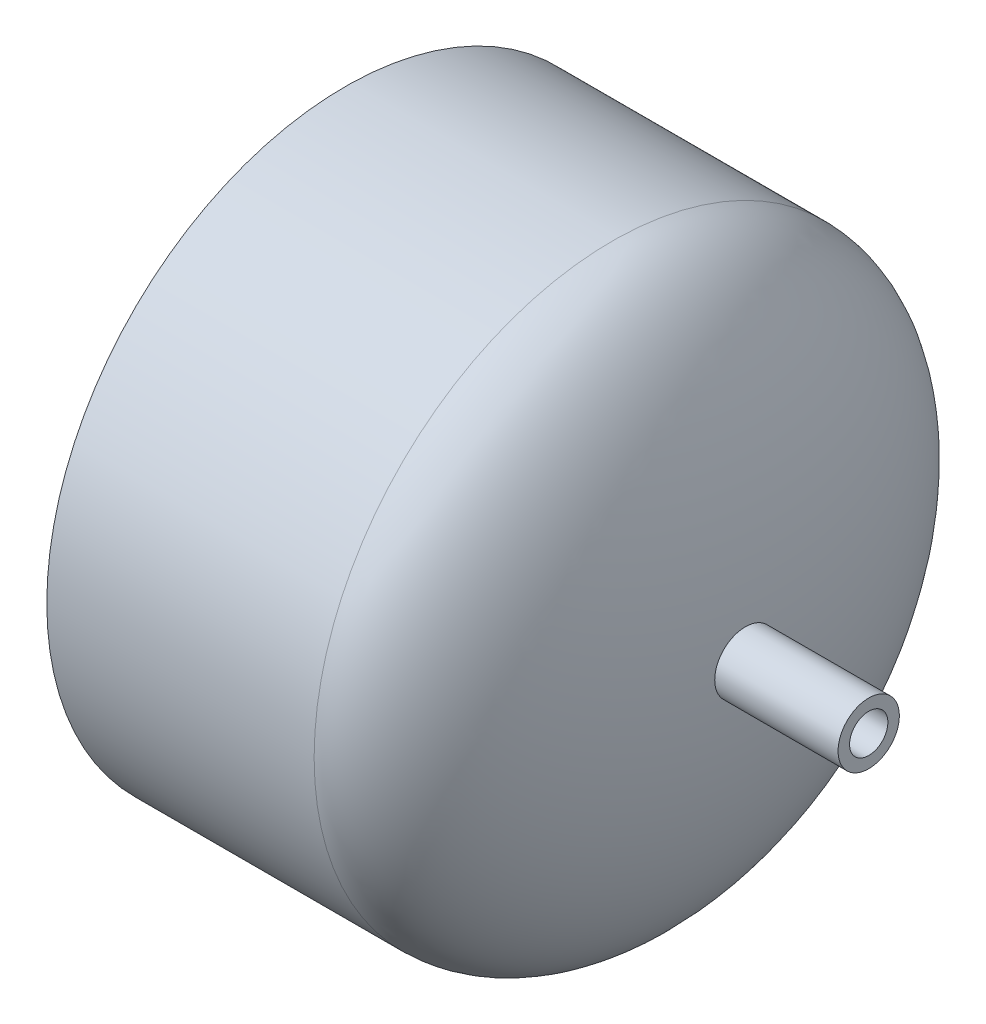
ISO-10303-21;
HEADER;
FILE_DESCRIPTION(('STEP AP214'),'2;1');
FILE_NAME('part.step','',(''),(''),'','','');
FILE_SCHEMA(('AUTOMOTIVE_DESIGN { 1 0 10303 214 1 1 1 1 }'));
ENDSEC;
DATA;
#1=APPLICATION_CONTEXT('core data for automotive mechanical design processes');
#2=APPLICATION_PROTOCOL_DEFINITION('international standard','automotive_design',2000,#1);
#3=PRODUCT_CONTEXT('',#1,'mechanical');
#4=PRODUCT('Part','Part','',(#3));
#5=PRODUCT_RELATED_PRODUCT_CATEGORY('part','',(#4));
#6=PRODUCT_DEFINITION_FORMATION('','',#4);
#7=PRODUCT_DEFINITION_CONTEXT('part definition',#1,'design');
#8=PRODUCT_DEFINITION('design','',#6,#7);
#9=PRODUCT_DEFINITION_SHAPE('','',#8);
#10=(LENGTH_UNIT() NAMED_UNIT(*) SI_UNIT(.MILLI.,.METRE.));
#11=(NAMED_UNIT(*) PLANE_ANGLE_UNIT() SI_UNIT($,.RADIAN.));
#12=(NAMED_UNIT(*) SI_UNIT($,.STERADIAN.) SOLID_ANGLE_UNIT());
#13=UNCERTAINTY_MEASURE_WITH_UNIT(LENGTH_MEASURE(1.E-05),#10,'distance_accuracy_value','');
#14=(GEOMETRIC_REPRESENTATION_CONTEXT(3) GLOBAL_UNCERTAINTY_ASSIGNED_CONTEXT((#13)) GLOBAL_UNIT_ASSIGNED_CONTEXT((#10,
#11,#12)) REPRESENTATION_CONTEXT('',''));
#15=CARTESIAN_POINT('',(0.,0.,0.));
#16=DIRECTION('',(0.,0.,1.));
#17=DIRECTION('',(1.,0.,0.));
#18=AXIS2_PLACEMENT_3D('',#15,#16,#17);
#19=CARTESIAN_POINT('',(-55.372,0.,0.));
#20=DIRECTION('',(0.,0.,1.));
#21=DIRECTION('',(0.,1.,0.));
#22=AXIS2_PLACEMENT_3D('',#19,#20,#21);
#23=ELLIPSE('',#22,123.571,55.372);
#24=TRIMMED_CURVE('',#23,(PARAMETER_VALUE(1.5707963267949)),(PARAMETER_VALUE(4.71238898038469)),
.T.,.PARAMETER.);
#25=CARTESIAN_POINT('',(-166.116,0.,0.));
#26=DIRECTION('',(-1.,0.,0.));
#27=AXIS1_PLACEMENT('',#25,#26);
#28=SURFACE_OF_REVOLUTION('',#24,#27);
#29=CARTESIAN_POINT('',(-0.293214830301786,0.,0.));
#30=DIRECTION('',(-1.,0.,0.));
#31=DIRECTION('',(0.,0.,1.));
#32=AXIS2_PLACEMENT_3D('',#29,#30,#31);
#33=CIRCLE('',#32,12.7);
#34=CARTESIAN_POINT('',(-0.293214830301786,0.,12.7));
#35=VERTEX_POINT('',#34);
#36=EDGE_CURVE('E11',#35,#35,#33,.F.);
#37=ORIENTED_EDGE('',*,*,#36,.F.);
#38=EDGE_LOOP('',(#37));
#39=FACE_BOUND('',#38,.T.);
#40=CARTESIAN_POINT('',(-55.372,0.,0.));
#41=DIRECTION('',(-1.,0.,0.));
#42=DIRECTION('',(0.,0.,1.));
#43=AXIS2_PLACEMENT_3D('',#40,#41,#42);
#44=CIRCLE('',#43,123.571);
#45=CARTESIAN_POINT('',(-55.372,0.,123.571));
#46=VERTEX_POINT('',#45);
#47=EDGE_CURVE('E56',#46,#46,#44,.T.);
#48=ORIENTED_EDGE('',*,*,#47,.F.);
#49=EDGE_LOOP('',(#48));
#50=FACE_BOUND('',#49,.T.);
#51=ADVANCED_FACE('F34',(#39,#50),#28,.F.);
#52=CARTESIAN_POINT('',(-55.372,0.,0.));
#53=DIRECTION('',(0.,0.,-1.));
#54=DIRECTION('',(0.,-1.,0.));
#55=AXIS2_PLACEMENT_3D('',#52,#53,#54);
#56=ELLIPSE('',#55,109.347,41.148);
#57=TRIMMED_CURVE('',#56,(PARAMETER_VALUE(4.71238898038469)),
(PARAMETER_VALUE(7.85398163397448)),.T.,.PARAMETER.);
#58=CARTESIAN_POINT('',(-166.116,0.,0.));
#59=DIRECTION('',(-1.,0.,0.));
#60=AXIS1_PLACEMENT('',#58,#59);
#61=SURFACE_OF_REVOLUTION('',#57,#60);
#62=CARTESIAN_POINT('',(-55.372,0.,0.));
#63=DIRECTION('',(-1.,0.,0.));
#64=DIRECTION('',(0.,0.,1.));
#65=AXIS2_PLACEMENT_3D('',#62,#63,#64);
#66=CIRCLE('',#65,109.347);
#67=CARTESIAN_POINT('',(-55.372,0.,109.347));
#68=VERTEX_POINT('',#67);
#69=EDGE_CURVE('E42',#68,#68,#66,.T.);
#70=ORIENTED_EDGE('',*,*,#69,.T.);
#71=EDGE_LOOP('',(#70));
#72=FACE_BOUND('',#71,.T.);
#73=CARTESIAN_POINT('',(-14.224,0.,0.));
#74=VERTEX_POINT('',#73);
#75=VERTEX_LOOP('',#74);
#76=FACE_BOUND('',#75,.T.);
#77=ADVANCED_FACE('F74',(#72,#76),#61,.F.);
#78=CARTESIAN_POINT('',(-55.372,0.,0.));
#79=DIRECTION('',(-1.,0.,0.));
#80=DIRECTION('',(0.,0.,1.));
#81=AXIS2_PLACEMENT_3D('',#78,#79,#80);
#82=CONICAL_SURFACE('',#81,109.347,0.00516050464875775);
#83=CARTESIAN_POINT('',(-166.116,0.,0.));
#84=DIRECTION('',(-1.,0.,0.));
#85=DIRECTION('',(0.,0.,1.));
#86=AXIS2_PLACEMENT_3D('',#83,#84,#85);
#87=CIRCLE('',#86,109.9185);
#88=CARTESIAN_POINT('',(-166.116,0.,109.9185));
#89=VERTEX_POINT('',#88);
#90=EDGE_CURVE('E67',#89,#89,#87,.T.);
#91=ORIENTED_EDGE('',*,*,#90,.T.);
#92=EDGE_LOOP('',(#91));
#93=FACE_BOUND('',#92,.T.);
#94=ORIENTED_EDGE('',*,*,#69,.F.);
#95=EDGE_LOOP('',(#94));
#96=FACE_BOUND('',#95,.T.);
#97=ADVANCED_FACE('F77',(#93,#96),#82,.F.);
#98=CARTESIAN_POINT('',(-166.116,-123.571,0.));
#99=DIRECTION('',(-1.,0.,0.));
#100=DIRECTION('',(0.,0.,1.));
#101=AXIS2_PLACEMENT_3D('',#98,#99,#100);
#102=PLANE('',#101);
#103=CARTESIAN_POINT('',(-166.116,0.,0.));
#104=DIRECTION('',(-1.,0.,0.));
#105=DIRECTION('',(0.,0.,1.));
#106=AXIS2_PLACEMENT_3D('',#103,#104,#105);
#107=CIRCLE('',#106,123.571);
#108=CARTESIAN_POINT('',(-166.116,0.,123.571));
#109=VERTEX_POINT('',#108);
#110=EDGE_CURVE('E59',#109,#109,#107,.T.);
#111=ORIENTED_EDGE('',*,*,#110,.T.);
#112=EDGE_LOOP('',(#111));
#113=FACE_BOUND('',#112,.T.);
#114=ORIENTED_EDGE('',*,*,#90,.F.);
#115=EDGE_LOOP('',(#114));
#116=FACE_BOUND('',#115,.T.);
#117=ADVANCED_FACE('F81',(#113,#116),#102,.T.);
#118=CARTESIAN_POINT('',(-166.116,0.,0.));
#119=DIRECTION('',(-1.,0.,0.));
#120=DIRECTION('',(0.,0.,1.));
#121=AXIS2_PLACEMENT_3D('',#118,#119,#120);
#122=CYLINDRICAL_SURFACE('',#121,123.571);
#123=ORIENTED_EDGE('',*,*,#47,.T.);
#124=EDGE_LOOP('',(#123));
#125=FACE_BOUND('',#124,.T.);
#126=ORIENTED_EDGE('',*,*,#110,.F.);
#127=EDGE_LOOP('',(#126));
#128=FACE_BOUND('',#127,.T.);
#129=ADVANCED_FACE('F85',(#125,#128),#122,.T.);
#130=CARTESIAN_POINT('',(-3.55600000000001,0.,0.));
#131=DIRECTION('',(1.,0.,0.));
#132=DIRECTION('',(0.,0.,-1.));
#133=AXIS2_PLACEMENT_3D('',#130,#131,#132);
#134=CYLINDRICAL_SURFACE('',#133,12.7);
#135=ORIENTED_EDGE('',*,*,#36,.T.);
#136=EDGE_LOOP('',(#135));
#137=FACE_BOUND('',#136,.T.);
#138=CARTESIAN_POINT('',(50.8,0.,0.));
#139=DIRECTION('',(1.,0.,0.));
#140=DIRECTION('',(0.,0.,-1.));
#141=AXIS2_PLACEMENT_3D('',#138,#139,#140);
#142=CIRCLE('',#141,12.7);
#143=CARTESIAN_POINT('',(50.8,0.,-12.7));
#144=VERTEX_POINT('',#143);
#145=EDGE_CURVE('E57',#144,#144,#142,.T.);
#146=ORIENTED_EDGE('',*,*,#145,.F.);
#147=EDGE_LOOP('',(#146));
#148=FACE_BOUND('',#147,.T.);
#149=ADVANCED_FACE('F89',(#137,#148),#134,.T.);
#150=CARTESIAN_POINT('',(-3.55600000000001,0.,0.));
#151=DIRECTION('',(1.,0.,0.));
#152=DIRECTION('',(0.,0.,-1.));
#153=AXIS2_PLACEMENT_3D('',#150,#151,#152);
#154=CYLINDRICAL_SURFACE('',#153,7.9375);
#155=CARTESIAN_POINT('',(-0.114351862750578,0.,0.));
#156=DIRECTION('',(-1.,0.,0.));
#157=DIRECTION('',(0.,0.,1.));
#158=AXIS2_PLACEMENT_3D('',#155,#156,#157);
#159=CIRCLE('',#158,7.9375);
#160=CARTESIAN_POINT('',(-0.114351862750578,0.,7.9375));
#161=VERTEX_POINT('',#160);
#162=EDGE_CURVE('E54',#161,#161,#159,.F.);
#163=ORIENTED_EDGE('',*,*,#162,.F.);
#164=EDGE_LOOP('',(#163));
#165=FACE_BOUND('',#164,.T.);
#166=CARTESIAN_POINT('',(50.8,0.,0.));
#167=DIRECTION('',(1.,0.,0.));
#168=DIRECTION('',(0.,0.,-1.));
#169=AXIS2_PLACEMENT_3D('',#166,#167,#168);
#170=CIRCLE('',#169,7.9375);
#171=CARTESIAN_POINT('',(50.8,0.,-7.9375));
#172=VERTEX_POINT('',#171);
#173=EDGE_CURVE('E62',#172,#172,#170,.T.);
#174=ORIENTED_EDGE('',*,*,#173,.T.);
#175=EDGE_LOOP('',(#174));
#176=FACE_BOUND('',#175,.T.);
#177=ADVANCED_FACE('F93',(#165,#176),#154,.F.);
#178=CARTESIAN_POINT('',(50.8,0.,0.));
#179=DIRECTION('',(1.,0.,0.));
#180=DIRECTION('',(0.,0.,-1.));
#181=AXIS2_PLACEMENT_3D('',#178,#179,#180);
#182=PLANE('',#181);
#183=ORIENTED_EDGE('',*,*,#145,.T.);
#184=EDGE_LOOP('',(#183));
#185=FACE_BOUND('',#184,.T.);
#186=ORIENTED_EDGE('',*,*,#173,.F.);
#187=EDGE_LOOP('',(#186));
#188=FACE_BOUND('',#187,.T.);
#189=ADVANCED_FACE('F51',(#185,#188),#182,.T.);
#190=CARTESIAN_POINT('',(0.,0.,0.));
#191=VERTEX_POINT('',#190);
#192=VERTEX_LOOP('',#191);
#193=FACE_BOUND('',#192,.T.);
#194=ORIENTED_EDGE('',*,*,#162,.T.);
#195=EDGE_LOOP('',(#194));
#196=FACE_BOUND('',#195,.T.);
#197=ADVANCED_FACE('F48',(#193,#196),#28,.F.);
#198=CLOSED_SHELL('',(#51,#77,#97,#117,#129,#149,#177,#189,#197));
#199=MANIFOLD_SOLID_BREP('B2',#198);
#200=ADVANCED_BREP_SHAPE_REPRESENTATION('',(#18,#199),#14);
#201=SHAPE_DEFINITION_REPRESENTATION(#9,#200);
ENDSEC;
END-ISO-10303-21;
